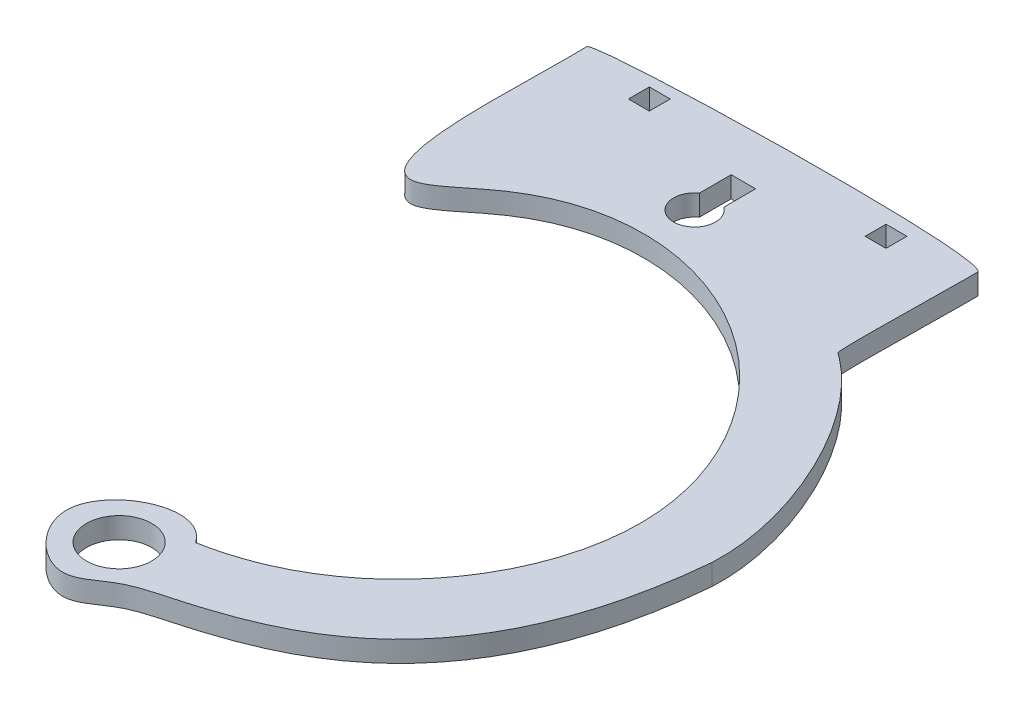
ISO-10303-21;
HEADER;
FILE_DESCRIPTION(('STEP AP214'),'2;1');
FILE_NAME('part.step','',(''),(''),'','','');
FILE_SCHEMA(('AUTOMOTIVE_DESIGN { 1 0 10303 214 1 1 1 1 }'));
ENDSEC;
DATA;
#1=APPLICATION_CONTEXT('core data for automotive mechanical design processes');
#2=APPLICATION_PROTOCOL_DEFINITION('international standard','automotive_design',2000,#1);
#3=PRODUCT_CONTEXT('',#1,'mechanical');
#4=PRODUCT('Part','Part','',(#3));
#5=PRODUCT_RELATED_PRODUCT_CATEGORY('part','',(#4));
#6=PRODUCT_DEFINITION_FORMATION('','',#4);
#7=PRODUCT_DEFINITION_CONTEXT('part definition',#1,'design');
#8=PRODUCT_DEFINITION('design','',#6,#7);
#9=PRODUCT_DEFINITION_SHAPE('','',#8);
#10=(LENGTH_UNIT() NAMED_UNIT(*) SI_UNIT(.MILLI.,.METRE.));
#11=(NAMED_UNIT(*) PLANE_ANGLE_UNIT() SI_UNIT($,.RADIAN.));
#12=(NAMED_UNIT(*) SI_UNIT($,.STERADIAN.) SOLID_ANGLE_UNIT());
#13=UNCERTAINTY_MEASURE_WITH_UNIT(LENGTH_MEASURE(1.E-05),#10,'distance_accuracy_value','');
#14=(GEOMETRIC_REPRESENTATION_CONTEXT(3) GLOBAL_UNCERTAINTY_ASSIGNED_CONTEXT((#13)) GLOBAL_UNIT_ASSIGNED_CONTEXT((#10,
#11,#12)) REPRESENTATION_CONTEXT('',''));
#15=CARTESIAN_POINT('',(0.,0.,0.));
#16=DIRECTION('',(0.,0.,1.));
#17=DIRECTION('',(1.,0.,0.));
#18=AXIS2_PLACEMENT_3D('',#15,#16,#17);
#19=CARTESIAN_POINT('',(5.52155748370861,3.,34.56171875));
#20=CARTESIAN_POINT('',(1.75457626593996,3.,29.0678926339568));
#21=CARTESIAN_POINT('',(-14.2628126377582,3.,37.3251737999894));
#22=CARTESIAN_POINT('',(-0.816124687698605,3.,50.4605636092557));
#23=CARTESIAN_POINT('',(4.47781550421018,3.,44.8708590645014));
#24=CARTESIAN_POINT('',(19.7672053678462,3.,40.7525704051218));
#25=CARTESIAN_POINT('',(41.8350730212651,3.,33.8354091874432));
#26=CARTESIAN_POINT('',(45.,3.,0.));
#27=B_SPLINE_CURVE_WITH_KNOTS('',3,(#19,#20,#21,#22,#23,#24,#25,#26),.UNSPECIFIED.,.F.,.F.,(4,1,
1,1,1,4),(0.,0.248435928445645,0.409115666517532,0.501869332977568,0.560957766325815,1.),.UNSPECIFIED.);
#28=DIRECTION('',(0.,-1.,0.));
#29=VECTOR('',#28,1.);
#30=SURFACE_OF_LINEAR_EXTRUSION('',#27,#29);
#31=CARTESIAN_POINT('',(5.52155748370861,0.,34.56171875));
#32=CARTESIAN_POINT('',(1.75457626593996,0.,29.0678926339568));
#33=CARTESIAN_POINT('',(-14.2628126377582,0.,37.3251737999894));
#34=CARTESIAN_POINT('',(-0.816124687698605,0.,50.4605636092557));
#35=CARTESIAN_POINT('',(4.47781550421018,0.,44.8708590645014));
#36=CARTESIAN_POINT('',(19.7672053678462,0.,40.7525704051218));
#37=CARTESIAN_POINT('',(41.8350730212651,0.,33.8354091874432));
#38=CARTESIAN_POINT('',(45.,0.,0.));
#39=B_SPLINE_CURVE_WITH_KNOTS('',3,(#31,#32,#33,#34,#35,#36,#37,#38),.UNSPECIFIED.,.F.,.F.,(4,1,
1,1,1,4),(0.,0.248435928445645,0.409115666517532,0.501869332977568,0.560957766325815,1.),.UNSPECIFIED.);
#40=CARTESIAN_POINT('',(5.5215574837086,0.,34.56171875));
#41=VERTEX_POINT('',#40);
#42=CARTESIAN_POINT('',(45.,0.,1.28897821374382E-13));
#43=VERTEX_POINT('',#42);
#44=EDGE_CURVE('E227',#41,#43,#39,.T.);
#45=ORIENTED_EDGE('',*,*,#44,.T.);
#46=DIRECTION('',(0.,-1.,0.));
#47=VECTOR('',#46,1.);
#48=CARTESIAN_POINT('',(45.,3.,1.28897821374382E-13));
#49=LINE('',#48,#47);
#50=CARTESIAN_POINT('',(45.,3.,1.28897821374382E-13));
#51=VERTEX_POINT('',#50);
#52=EDGE_CURVE('E320',#51,#43,#49,.T.);
#53=ORIENTED_EDGE('',*,*,#52,.F.);
#54=CARTESIAN_POINT('',(5.5215574837086,3.,34.56171875));
#55=VERTEX_POINT('',#54);
#56=EDGE_CURVE('E230',#55,#51,#27,.T.);
#57=ORIENTED_EDGE('',*,*,#56,.F.);
#58=DIRECTION('',(0.,-1.,0.));
#59=VECTOR('',#58,1.);
#60=CARTESIAN_POINT('',(5.5215574837086,3.,34.56171875));
#61=LINE('',#60,#59);
#62=EDGE_CURVE('E245',#55,#41,#61,.T.);
#63=ORIENTED_EDGE('',*,*,#62,.T.);
#64=EDGE_LOOP('',(#45,#53,#57,#63));
#65=FACE_BOUND('',#64,.T.);
#66=ADVANCED_FACE('F32',(#65),#30,.F.);
#67=CARTESIAN_POINT('',(45.,3.,1.28897821374382E-13));
#68=CARTESIAN_POINT('',(45.5872356507686,3.,-11.4498091188039));
#69=CARTESIAN_POINT('',(37.5515269769713,3.,-28.3604836527118));
#70=CARTESIAN_POINT('',(27.6537379425122,3.,-35.2406958171902));
#71=CARTESIAN_POINT('',(27.9669395349281,3.,-46.9502889949367));
#72=CARTESIAN_POINT('',(28.0110395879902,3.,-57.6879686278624));
#73=CARTESIAN_POINT('',(-28.043237247077,3.,-56.5041897316936));
#74=CARTESIAN_POINT('',(-27.7225426285753,3.,-45.3474768332037));
#75=CARTESIAN_POINT('',(-30.2261834831274,3.,-17.9966032347248));
#76=CARTESIAN_POINT('',(-9.40725411177826,3.,-38.5434879286303));
#77=CARTESIAN_POINT('',(20.3750158900972,3.,-35.3512461572392));
#78=CARTESIAN_POINT('',(44.4623985292645,3.,2.85883580250558));
#79=CARTESIAN_POINT('',(23.4410009987943,3.,31.4117383992043));
#80=CARTESIAN_POINT('',(5.5215574837086,3.,34.56171875));
#81=B_SPLINE_CURVE_WITH_KNOTS('',3,(#67,#68,#69,#70,#71,#72,#73,#74,#75,#76,#77,#78,#79,#80),
.UNSPECIFIED.,.F.,.F.,(4,2,2,2,1,1,1,1,4),(0.,0.689052401124645,0.714031936093828,
0.722373130739638,0.775899340140621,0.791729341638379,0.851260650378715,0.917162435133628,1.),.UNSPECIFIED.);
#82=DIRECTION('',(0.,-1.,0.));
#83=VECTOR('',#82,1.);
#84=SURFACE_OF_LINEAR_EXTRUSION('',#81,#83);
#85=CARTESIAN_POINT('',(45.,0.,1.28897821374382E-13));
#86=CARTESIAN_POINT('',(45.5872356507686,0.,-11.4498091188039));
#87=CARTESIAN_POINT('',(37.5515269769713,0.,-28.3604836527118));
#88=CARTESIAN_POINT('',(27.6537379425122,0.,-35.2406958171902));
#89=CARTESIAN_POINT('',(27.9669395349281,0.,-46.9502889949367));
#90=CARTESIAN_POINT('',(28.0110395879902,0.,-57.6879686278624));
#91=CARTESIAN_POINT('',(-28.043237247077,0.,-56.5041897316936));
#92=CARTESIAN_POINT('',(-27.7225426285753,0.,-45.3474768332037));
#93=CARTESIAN_POINT('',(-30.2261834831274,0.,-17.9966032347248));
#94=CARTESIAN_POINT('',(-9.40725411177826,0.,-38.5434879286303));
#95=CARTESIAN_POINT('',(20.3750158900972,0.,-35.3512461572392));
#96=CARTESIAN_POINT('',(44.4623985292645,0.,2.85883580250558));
#97=CARTESIAN_POINT('',(23.4410009987943,0.,31.4117383992043));
#98=CARTESIAN_POINT('',(5.5215574837086,0.,34.56171875));
#99=B_SPLINE_CURVE_WITH_KNOTS('',3,(#85,#86,#87,#88,#89,#90,#91,#92,#93,#94,#95,#96,#97,#98),
.UNSPECIFIED.,.F.,.F.,(4,2,2,2,1,1,1,1,4),(0.,0.689052401124645,0.714031936093828,
0.722373130739638,0.775899340140621,0.791729341638379,0.851260650378715,0.917162435133628,1.),.UNSPECIFIED.);
#100=EDGE_CURVE('E237',#43,#41,#99,.T.);
#101=ORIENTED_EDGE('',*,*,#100,.T.);
#102=ORIENTED_EDGE('',*,*,#62,.F.);
#103=EDGE_CURVE('E236',#51,#55,#81,.T.);
#104=ORIENTED_EDGE('',*,*,#103,.F.);
#105=ORIENTED_EDGE('',*,*,#52,.T.);
#106=EDGE_LOOP('',(#101,#102,#104,#105));
#107=FACE_BOUND('',#106,.T.);
#108=ADVANCED_FACE('F252',(#107),#84,.F.);
#109=CARTESIAN_POINT('',(5.42939376748954,3.,44.9508710166322));
#110=DIRECTION('',(0.,1.,0.));
#111=DIRECTION('',(0.,0.,1.));
#112=AXIS2_PLACEMENT_3D('',#109,#110,#111);
#113=PLANE('',#112);
#114=DIRECTION('',(-0.00227950526595147,0.,0.999997401924496));
#115=VECTOR('',#114,1.);
#116=CARTESIAN_POINT('',(-18.5103042809626,3.,-54.5046172028867));
#117=LINE('',#116,#115);
#118=CARTESIAN_POINT('',(-18.5103042809626,3.,-54.5046172028867));
#119=VERTEX_POINT('',#118);
#120=CARTESIAN_POINT('',(-18.5171427967605,3.,-51.5046249971132));
#121=VERTEX_POINT('',#120);
#122=EDGE_CURVE('E47',#119,#121,#117,.T.);
#123=ORIENTED_EDGE('',*,*,#122,.F.);
#124=DIRECTION('',(-0.999997401924496,0.,-0.00227950526595263));
#125=VECTOR('',#124,1.);
#126=CARTESIAN_POINT('',(-18.5103042809626,3.,-54.5046172028867));
#127=LINE('',#126,#125);
#128=CARTESIAN_POINT('',(-15.5103120751892,3.,-54.4977786870889));
#129=VERTEX_POINT('',#128);
#130=EDGE_CURVE('E154',#129,#119,#127,.T.);
#131=ORIENTED_EDGE('',*,*,#130,.F.);
#132=DIRECTION('',(0.00227950526595147,0.,-0.999997401924496));
#133=VECTOR('',#132,1.);
#134=CARTESIAN_POINT('',(-15.5103120751892,3.,-54.4977786870889));
#135=LINE('',#134,#133);
#136=CARTESIAN_POINT('',(-15.517150590987,3.,-51.4977864813154));
#137=VERTEX_POINT('',#136);
#138=EDGE_CURVE('E157',#137,#129,#135,.T.);
#139=ORIENTED_EDGE('',*,*,#138,.F.);
#140=DIRECTION('',(0.999997401924496,0.,0.00227950526595263));
#141=VECTOR('',#140,1.);
#142=CARTESIAN_POINT('',(-18.5171427967605,3.,-51.5046249971132));
#143=LINE('',#142,#141);
#144=EDGE_CURVE('E163',#121,#137,#143,.T.);
#145=ORIENTED_EDGE('',*,*,#144,.F.);
#146=EDGE_LOOP('',(#123,#131,#139,#145));
#147=FACE_BOUND('',#146,.T.);
#148=DIRECTION('',(-0.00227950526595262,0.,0.999997401924496));
#149=VECTOR('',#148,1.);
#150=CARTESIAN_POINT('',(15.4827688686724,3.,-51.4271218180709));
#151=LINE('',#150,#149);
#152=CARTESIAN_POINT('',(15.4896073844703,3.,-54.4271140238444));
#153=VERTEX_POINT('',#152);
#154=CARTESIAN_POINT('',(15.4827688686724,3.,-51.4271218180709));
#155=VERTEX_POINT('',#154);
#156=EDGE_CURVE('E55',#153,#155,#151,.T.);
#157=ORIENTED_EDGE('',*,*,#156,.F.);
#158=DIRECTION('',(-0.999997401924496,0.,-0.00227950526595262));
#159=VECTOR('',#158,1.);
#160=CARTESIAN_POINT('',(15.4896073844703,3.,-54.4271140238444));
#161=LINE('',#160,#159);
#162=CARTESIAN_POINT('',(18.4895995902438,3.,-54.4202755080465));
#163=VERTEX_POINT('',#162);
#164=EDGE_CURVE('E178',#163,#153,#161,.T.);
#165=ORIENTED_EDGE('',*,*,#164,.F.);
#166=DIRECTION('',(0.00227950526595263,0.,-0.999997401924496));
#167=VECTOR('',#166,1.);
#168=CARTESIAN_POINT('',(18.4827610744459,3.,-51.420283302273));
#169=LINE('',#168,#167);
#170=CARTESIAN_POINT('',(18.4827610744459,3.,-51.420283302273));
#171=VERTEX_POINT('',#170);
#172=EDGE_CURVE('E192',#171,#163,#169,.T.);
#173=ORIENTED_EDGE('',*,*,#172,.F.);
#174=DIRECTION('',(0.999997401924496,0.,0.00227950526595031));
#175=VECTOR('',#174,1.);
#176=CARTESIAN_POINT('',(15.4827688686724,3.,-51.4271218180709));
#177=LINE('',#176,#175);
#178=EDGE_CURVE('E189',#155,#171,#177,.T.);
#179=ORIENTED_EDGE('',*,*,#178,.F.);
#180=EDGE_LOOP('',(#157,#165,#173,#179));
#181=FACE_BOUND('',#180,.T.);
#182=DIRECTION('',(0.,0.,1.));
#183=VECTOR('',#182,1.);
#184=CARTESIAN_POINT('',(-1.75,3.,-41.4717962113212));
#185=LINE('',#184,#183);
#186=CARTESIAN_POINT('',(-1.75,3.,-49.4717962113212));
#187=VERTEX_POINT('',#186);
#188=CARTESIAN_POINT('',(-1.75,3.,-44.9084947975235));
#189=VERTEX_POINT('',#188);
#190=EDGE_CURVE('E170',#187,#189,#185,.T.);
#191=ORIENTED_EDGE('',*,*,#190,.F.);
#192=DIRECTION('',(-1.,0.,0.));
#193=VECTOR('',#192,1.);
#194=CARTESIAN_POINT('',(1.75,3.,-49.4717962113212));
#195=LINE('',#194,#193);
#196=CARTESIAN_POINT('',(1.75,3.,-49.4717962113212));
#197=VERTEX_POINT('',#196);
#198=EDGE_CURVE('E207',#197,#187,#195,.T.);
#199=ORIENTED_EDGE('',*,*,#198,.F.);
#200=DIRECTION('',(0.,0.,-1.));
#201=VECTOR('',#200,1.);
#202=CARTESIAN_POINT('',(1.75,3.,-41.4717962113212));
#203=LINE('',#202,#201);
#204=CARTESIAN_POINT('',(1.75,3.,-44.9084947975235));
#205=VERTEX_POINT('',#204);
#206=EDGE_CURVE('E204',#205,#197,#203,.T.);
#207=ORIENTED_EDGE('',*,*,#206,.F.);
#208=CARTESIAN_POINT('',(0.,3.,-42.4717962113212));
#209=DIRECTION('',(0.,1.,0.));
#210=DIRECTION('',(0.,0.,1.));
#211=AXIS2_PLACEMENT_3D('',#208,#209,#210);
#212=CIRCLE('',#211,3.);
#213=EDGE_CURVE('E220',#189,#205,#212,.T.);
#214=ORIENTED_EDGE('',*,*,#213,.F.);
#215=EDGE_LOOP('',(#191,#199,#207,#214));
#216=FACE_BOUND('',#215,.T.);
#217=CARTESIAN_POINT('',(0.,3.,40.));
#218=DIRECTION('',(0.,1.,0.));
#219=DIRECTION('',(0.,0.,1.));
#220=AXIS2_PLACEMENT_3D('',#217,#218,#219);
#221=CIRCLE('',#220,4.675);
#222=CARTESIAN_POINT('',(0.,3.,44.675));
#223=VERTEX_POINT('',#222);
#224=EDGE_CURVE('E228',#223,#223,#221,.T.);
#225=ORIENTED_EDGE('',*,*,#224,.F.);
#226=EDGE_LOOP('',(#225));
#227=FACE_BOUND('',#226,.T.);
#228=ORIENTED_EDGE('',*,*,#56,.T.);
#229=ORIENTED_EDGE('',*,*,#103,.T.);
#230=EDGE_LOOP('',(#228,#229));
#231=FACE_BOUND('',#230,.T.);
#232=ADVANCED_FACE('F255',(#147,#181,#216,#227,#231),#113,.T.);
#233=CARTESIAN_POINT('',(5.42939376748954,0.,44.9508710166322));
#234=DIRECTION('',(0.,1.,0.));
#235=DIRECTION('',(0.,0.,1.));
#236=AXIS2_PLACEMENT_3D('',#233,#234,#235);
#237=PLANE('',#236);
#238=DIRECTION('',(-0.999997401924496,0.,-0.00227950526595263));
#239=VECTOR('',#238,1.);
#240=CARTESIAN_POINT('',(-18.5103042809626,0.,-54.5046172028867));
#241=LINE('',#240,#239);
#242=CARTESIAN_POINT('',(-15.5103120751892,0.,-54.4977786870889));
#243=VERTEX_POINT('',#242);
#244=CARTESIAN_POINT('',(-18.5103042809626,0.,-54.5046172028867));
#245=VERTEX_POINT('',#244);
#246=EDGE_CURVE('E141',#243,#245,#241,.T.);
#247=ORIENTED_EDGE('',*,*,#246,.T.);
#248=DIRECTION('',(-0.00227950526595147,0.,0.999997401924496));
#249=VECTOR('',#248,1.);
#250=CARTESIAN_POINT('',(-18.5103042809626,0.,-54.5046172028867));
#251=LINE('',#250,#249);
#252=CARTESIAN_POINT('',(-18.5171427967605,0.,-51.5046249971132));
#253=VERTEX_POINT('',#252);
#254=EDGE_CURVE('E135',#245,#253,#251,.T.);
#255=ORIENTED_EDGE('',*,*,#254,.T.);
#256=DIRECTION('',(0.999997401924496,0.,0.00227950526595263));
#257=VECTOR('',#256,1.);
#258=CARTESIAN_POINT('',(-18.5171427967605,0.,-51.5046249971132));
#259=LINE('',#258,#257);
#260=CARTESIAN_POINT('',(-15.517150590987,0.,-51.4977864813154));
#261=VERTEX_POINT('',#260);
#262=EDGE_CURVE('E145',#253,#261,#259,.T.);
#263=ORIENTED_EDGE('',*,*,#262,.T.);
#264=DIRECTION('',(0.00227950526595147,0.,-0.999997401924496));
#265=VECTOR('',#264,1.);
#266=CARTESIAN_POINT('',(-15.5103120751892,0.,-54.4977786870889));
#267=LINE('',#266,#265);
#268=EDGE_CURVE('E149',#261,#243,#267,.T.);
#269=ORIENTED_EDGE('',*,*,#268,.T.);
#270=EDGE_LOOP('',(#247,#255,#263,#269));
#271=FACE_BOUND('',#270,.T.);
#272=DIRECTION('',(-0.999997401924496,0.,-0.00227950526595262));
#273=VECTOR('',#272,1.);
#274=CARTESIAN_POINT('',(15.4896073844703,0.,-54.4271140238444));
#275=LINE('',#274,#273);
#276=CARTESIAN_POINT('',(18.4895995902438,0.,-54.4202755080465));
#277=VERTEX_POINT('',#276);
#278=CARTESIAN_POINT('',(15.4896073844703,0.,-54.4271140238444));
#279=VERTEX_POINT('',#278);
#280=EDGE_CURVE('E184',#277,#279,#275,.T.);
#281=ORIENTED_EDGE('',*,*,#280,.T.);
#282=DIRECTION('',(-0.00227950526595262,0.,0.999997401924496));
#283=VECTOR('',#282,1.);
#284=CARTESIAN_POINT('',(15.4827688686724,0.,-51.4271218180709));
#285=LINE('',#284,#283);
#286=CARTESIAN_POINT('',(15.4827688686724,0.,-51.4271218180709));
#287=VERTEX_POINT('',#286);
#288=EDGE_CURVE('E174',#279,#287,#285,.T.);
#289=ORIENTED_EDGE('',*,*,#288,.T.);
#290=DIRECTION('',(0.999997401924496,0.,0.00227950526595031));
#291=VECTOR('',#290,1.);
#292=CARTESIAN_POINT('',(15.4827688686724,0.,-51.4271218180709));
#293=LINE('',#292,#291);
#294=CARTESIAN_POINT('',(18.4827610744459,0.,-51.420283302273));
#295=VERTEX_POINT('',#294);
#296=EDGE_CURVE('E177',#287,#295,#293,.T.);
#297=ORIENTED_EDGE('',*,*,#296,.T.);
#298=DIRECTION('',(0.00227950526595263,0.,-0.999997401924496));
#299=VECTOR('',#298,1.);
#300=CARTESIAN_POINT('',(18.4827610744459,0.,-51.420283302273));
#301=LINE('',#300,#299);
#302=EDGE_CURVE('E181',#295,#277,#301,.T.);
#303=ORIENTED_EDGE('',*,*,#302,.T.);
#304=EDGE_LOOP('',(#281,#289,#297,#303));
#305=FACE_BOUND('',#304,.T.);
#306=DIRECTION('',(-1.,0.,0.));
#307=VECTOR('',#306,1.);
#308=CARTESIAN_POINT('',(5.42939376748954,0.,-49.4717962113212));
#309=LINE('',#308,#307);
#310=CARTESIAN_POINT('',(1.75,0.,-49.4717962113212));
#311=VERTEX_POINT('',#310);
#312=CARTESIAN_POINT('',(-1.75,0.,-49.4717962113212));
#313=VERTEX_POINT('',#312);
#314=EDGE_CURVE('E11',#311,#313,#309,.T.);
#315=ORIENTED_EDGE('',*,*,#314,.T.);
#316=DIRECTION('',(0.,0.,1.));
#317=VECTOR('',#316,1.);
#318=CARTESIAN_POINT('',(-1.75,0.,44.9508710166322));
#319=LINE('',#318,#317);
#320=CARTESIAN_POINT('',(-1.75,0.,-44.9084947975235));
#321=VERTEX_POINT('',#320);
#322=EDGE_CURVE('E217',#313,#321,#319,.T.);
#323=ORIENTED_EDGE('',*,*,#322,.T.);
#324=CARTESIAN_POINT('',(0.,0.,-42.4717962113212));
#325=DIRECTION('',(0.,1.,0.));
#326=DIRECTION('',(0.,0.,1.));
#327=AXIS2_PLACEMENT_3D('',#324,#325,#326);
#328=CIRCLE('',#327,3.);
#329=CARTESIAN_POINT('',(1.75,0.,-44.9084947975235));
#330=VERTEX_POINT('',#329);
#331=EDGE_CURVE('E223',#321,#330,#328,.T.);
#332=ORIENTED_EDGE('',*,*,#331,.T.);
#333=DIRECTION('',(0.,0.,-1.));
#334=VECTOR('',#333,1.);
#335=CARTESIAN_POINT('',(1.75,0.,44.9508710166322));
#336=LINE('',#335,#334);
#337=EDGE_CURVE('E213',#330,#311,#336,.T.);
#338=ORIENTED_EDGE('',*,*,#337,.T.);
#339=EDGE_LOOP('',(#315,#323,#332,#338));
#340=FACE_BOUND('',#339,.T.);
#341=CARTESIAN_POINT('',(0.,0.,40.));
#342=DIRECTION('',(0.,1.,0.));
#343=DIRECTION('',(0.,0.,1.));
#344=AXIS2_PLACEMENT_3D('',#341,#342,#343);
#345=CIRCLE('',#344,4.675);
#346=CARTESIAN_POINT('',(0.,0.,44.675));
#347=VERTEX_POINT('',#346);
#348=EDGE_CURVE('E224',#347,#347,#345,.T.);
#349=ORIENTED_EDGE('',*,*,#348,.T.);
#350=EDGE_LOOP('',(#349));
#351=FACE_BOUND('',#350,.T.);
#352=ORIENTED_EDGE('',*,*,#44,.F.);
#353=ORIENTED_EDGE('',*,*,#100,.F.);
#354=EDGE_LOOP('',(#352,#353));
#355=FACE_BOUND('',#354,.T.);
#356=ADVANCED_FACE('F151',(#271,#305,#340,#351,#355),#237,.F.);
#357=CARTESIAN_POINT('',(0.,0.,40.));
#358=DIRECTION('',(0.,1.,0.));
#359=DIRECTION('',(0.,0.,1.));
#360=AXIS2_PLACEMENT_3D('',#357,#358,#359);
#361=CYLINDRICAL_SURFACE('',#360,4.675);
#362=ORIENTED_EDGE('',*,*,#348,.F.);
#363=EDGE_LOOP('',(#362));
#364=FACE_BOUND('',#363,.T.);
#365=ORIENTED_EDGE('',*,*,#224,.T.);
#366=EDGE_LOOP('',(#365));
#367=FACE_BOUND('',#366,.T.);
#368=ADVANCED_FACE('F259',(#364,#367),#361,.F.);
#369=CARTESIAN_POINT('',(0.,-3.,-42.4717962113212));
#370=DIRECTION('',(0.,1.,0.));
#371=DIRECTION('',(0.,0.,1.));
#372=AXIS2_PLACEMENT_3D('',#369,#370,#371);
#373=CYLINDRICAL_SURFACE('',#372,3.);
#374=ORIENTED_EDGE('',*,*,#331,.F.);
#375=DIRECTION('',(0.,1.,0.));
#376=VECTOR('',#375,1.);
#377=CARTESIAN_POINT('',(-1.75,-3.,-44.9084947975235));
#378=LINE('',#377,#376);
#379=EDGE_CURVE('E40',#321,#189,#378,.T.);
#380=ORIENTED_EDGE('',*,*,#379,.T.);
#381=ORIENTED_EDGE('',*,*,#213,.T.);
#382=DIRECTION('',(0.,1.,0.));
#383=VECTOR('',#382,1.);
#384=CARTESIAN_POINT('',(1.75,-3.,-44.9084947975235));
#385=LINE('',#384,#383);
#386=EDGE_CURVE('E331',#205,#330,#385,.F.);
#387=ORIENTED_EDGE('',*,*,#386,.T.);
#388=EDGE_LOOP('',(#374,#380,#381,#387));
#389=FACE_BOUND('',#388,.T.);
#390=ADVANCED_FACE('F265',(#389),#373,.F.);
#391=CARTESIAN_POINT('',(1.75,-3.,-49.4717962113212));
#392=DIRECTION('',(0.,0.,-1.));
#393=DIRECTION('',(-1.,0.,0.));
#394=AXIS2_PLACEMENT_3D('',#391,#392,#393);
#395=PLANE('',#394);
#396=DIRECTION('',(0.,1.,0.));
#397=VECTOR('',#396,1.);
#398=CARTESIAN_POINT('',(1.75,-3.,-49.4717962113212));
#399=LINE('',#398,#397);
#400=EDGE_CURVE('E210',#311,#197,#399,.T.);
#401=ORIENTED_EDGE('',*,*,#400,.T.);
#402=ORIENTED_EDGE('',*,*,#198,.T.);
#403=DIRECTION('',(0.,1.,0.));
#404=VECTOR('',#403,1.);
#405=CARTESIAN_POINT('',(-1.75,-3.,-49.4717962113212));
#406=LINE('',#405,#404);
#407=EDGE_CURVE('E211',#313,#187,#406,.T.);
#408=ORIENTED_EDGE('',*,*,#407,.F.);
#409=ORIENTED_EDGE('',*,*,#314,.F.);
#410=EDGE_LOOP('',(#401,#402,#408,#409));
#411=FACE_BOUND('',#410,.T.);
#412=ADVANCED_FACE('F269',(#411),#395,.F.);
#413=CARTESIAN_POINT('',(-1.75,-3.,-41.4717962113212));
#414=DIRECTION('',(-1.,0.,0.));
#415=DIRECTION('',(0.,0.,1.));
#416=AXIS2_PLACEMENT_3D('',#413,#414,#415);
#417=PLANE('',#416);
#418=ORIENTED_EDGE('',*,*,#407,.T.);
#419=ORIENTED_EDGE('',*,*,#190,.T.);
#420=ORIENTED_EDGE('',*,*,#379,.F.);
#421=ORIENTED_EDGE('',*,*,#322,.F.);
#422=EDGE_LOOP('',(#418,#419,#420,#421));
#423=FACE_BOUND('',#422,.T.);
#424=ADVANCED_FACE('F271',(#423),#417,.F.);
#425=CARTESIAN_POINT('',(1.75,-3.,-41.4717962113212));
#426=DIRECTION('',(1.,0.,0.));
#427=DIRECTION('',(0.,0.,-1.));
#428=AXIS2_PLACEMENT_3D('',#425,#426,#427);
#429=PLANE('',#428);
#430=ORIENTED_EDGE('',*,*,#386,.F.);
#431=ORIENTED_EDGE('',*,*,#206,.T.);
#432=ORIENTED_EDGE('',*,*,#400,.F.);
#433=ORIENTED_EDGE('',*,*,#337,.F.);
#434=EDGE_LOOP('',(#430,#431,#432,#433));
#435=FACE_BOUND('',#434,.T.);
#436=ADVANCED_FACE('F274',(#435),#429,.F.);
#437=CARTESIAN_POINT('',(15.4827688686724,0.,-51.4271218180709));
#438=DIRECTION('',(-0.999997401924496,0.,-0.00227950526595262));
#439=DIRECTION('',(-0.00227950526595262,0.,0.999997401924496));
#440=AXIS2_PLACEMENT_3D('',#437,#438,#439);
#441=PLANE('',#440);
#442=ORIENTED_EDGE('',*,*,#156,.T.);
#443=DIRECTION('',(0.,1.,0.));
#444=VECTOR('',#443,1.);
#445=CARTESIAN_POINT('',(15.4827688686724,0.,-51.4271218180709));
#446=LINE('',#445,#444);
#447=EDGE_CURVE('E187',#287,#155,#446,.T.);
#448=ORIENTED_EDGE('',*,*,#447,.F.);
#449=ORIENTED_EDGE('',*,*,#288,.F.);
#450=DIRECTION('',(0.,1.,0.));
#451=VECTOR('',#450,1.);
#452=CARTESIAN_POINT('',(15.4896073844703,0.,-54.4271140238444));
#453=LINE('',#452,#451);
#454=EDGE_CURVE('E164',#279,#153,#453,.T.);
#455=ORIENTED_EDGE('',*,*,#454,.T.);
#456=EDGE_LOOP('',(#442,#448,#449,#455));
#457=FACE_BOUND('',#456,.T.);
#458=ADVANCED_FACE('F278',(#457),#441,.F.);
#459=CARTESIAN_POINT('',(15.4896073844703,0.,-54.4271140238444));
#460=DIRECTION('',(0.00227950526595262,0.,-0.999997401924496));
#461=DIRECTION('',(-0.999997401924496,0.,-0.00227950526595262));
#462=AXIS2_PLACEMENT_3D('',#459,#460,#461);
#463=PLANE('',#462);
#464=ORIENTED_EDGE('',*,*,#164,.T.);
#465=ORIENTED_EDGE('',*,*,#454,.F.);
#466=ORIENTED_EDGE('',*,*,#280,.F.);
#467=DIRECTION('',(0.,1.,0.));
#468=VECTOR('',#467,1.);
#469=CARTESIAN_POINT('',(18.4895995902438,0.,-54.4202755080465));
#470=LINE('',#469,#468);
#471=EDGE_CURVE('E198',#277,#163,#470,.T.);
#472=ORIENTED_EDGE('',*,*,#471,.T.);
#473=EDGE_LOOP('',(#464,#465,#466,#472));
#474=FACE_BOUND('',#473,.T.);
#475=ADVANCED_FACE('F285',(#474),#463,.F.);
#476=CARTESIAN_POINT('',(18.4827610744459,0.,-51.420283302273));
#477=DIRECTION('',(0.999997401924496,0.,0.00227950526595263));
#478=DIRECTION('',(0.00227950526595263,0.,-0.999997401924496));
#479=AXIS2_PLACEMENT_3D('',#476,#477,#478);
#480=PLANE('',#479);
#481=ORIENTED_EDGE('',*,*,#172,.T.);
#482=ORIENTED_EDGE('',*,*,#471,.F.);
#483=ORIENTED_EDGE('',*,*,#302,.F.);
#484=DIRECTION('',(0.,1.,0.));
#485=VECTOR('',#484,1.);
#486=CARTESIAN_POINT('',(18.4827610744459,0.,-51.420283302273));
#487=LINE('',#486,#485);
#488=EDGE_CURVE('E200',#295,#171,#487,.T.);
#489=ORIENTED_EDGE('',*,*,#488,.T.);
#490=EDGE_LOOP('',(#481,#482,#483,#489));
#491=FACE_BOUND('',#490,.T.);
#492=ADVANCED_FACE('F289',(#491),#480,.F.);
#493=CARTESIAN_POINT('',(15.4827688686724,0.,-51.4271218180709));
#494=DIRECTION('',(-0.00227950526595031,0.,0.999997401924496));
#495=DIRECTION('',(0.999997401924496,0.,0.00227950526595031));
#496=AXIS2_PLACEMENT_3D('',#493,#494,#495);
#497=PLANE('',#496);
#498=ORIENTED_EDGE('',*,*,#178,.T.);
#499=ORIENTED_EDGE('',*,*,#488,.F.);
#500=ORIENTED_EDGE('',*,*,#296,.F.);
#501=ORIENTED_EDGE('',*,*,#447,.T.);
#502=EDGE_LOOP('',(#498,#499,#500,#501));
#503=FACE_BOUND('',#502,.T.);
#504=ADVANCED_FACE('F286',(#503),#497,.F.);
#505=CARTESIAN_POINT('',(-18.5103042809626,0.,-54.5046172028867));
#506=DIRECTION('',(-0.999997401924496,0.,-0.00227950526595147));
#507=DIRECTION('',(-0.00227950526595147,0.,0.999997401924496));
#508=AXIS2_PLACEMENT_3D('',#505,#506,#507);
#509=PLANE('',#508);
#510=ORIENTED_EDGE('',*,*,#122,.T.);
#511=DIRECTION('',(0.,1.,0.));
#512=VECTOR('',#511,1.);
#513=CARTESIAN_POINT('',(-18.5171427967605,0.,-51.5046249971132));
#514=LINE('',#513,#512);
#515=EDGE_CURVE('E131',#253,#121,#514,.T.);
#516=ORIENTED_EDGE('',*,*,#515,.F.);
#517=ORIENTED_EDGE('',*,*,#254,.F.);
#518=DIRECTION('',(0.,1.,0.));
#519=VECTOR('',#518,1.);
#520=CARTESIAN_POINT('',(-18.5103042809626,0.,-54.5046172028867));
#521=LINE('',#520,#519);
#522=EDGE_CURVE('E168',#245,#119,#521,.T.);
#523=ORIENTED_EDGE('',*,*,#522,.T.);
#524=EDGE_LOOP('',(#510,#516,#517,#523));
#525=FACE_BOUND('',#524,.T.);
#526=ADVANCED_FACE('F133',(#525),#509,.F.);
#527=CARTESIAN_POINT('',(-18.5103042809626,0.,-54.5046172028867));
#528=DIRECTION('',(0.00227950526595263,0.,-0.999997401924496));
#529=DIRECTION('',(-0.999997401924496,0.,-0.00227950526595263));
#530=AXIS2_PLACEMENT_3D('',#527,#528,#529);
#531=PLANE('',#530);
#532=ORIENTED_EDGE('',*,*,#130,.T.);
#533=ORIENTED_EDGE('',*,*,#522,.F.);
#534=ORIENTED_EDGE('',*,*,#246,.F.);
#535=DIRECTION('',(0.,1.,0.));
#536=VECTOR('',#535,1.);
#537=CARTESIAN_POINT('',(-15.5103120751892,0.,-54.4977786870889));
#538=LINE('',#537,#536);
#539=EDGE_CURVE('E171',#243,#129,#538,.T.);
#540=ORIENTED_EDGE('',*,*,#539,.T.);
#541=EDGE_LOOP('',(#532,#533,#534,#540));
#542=FACE_BOUND('',#541,.T.);
#543=ADVANCED_FACE('F299',(#542),#531,.F.);
#544=CARTESIAN_POINT('',(-15.5103120751892,0.,-54.4977786870889));
#545=DIRECTION('',(0.999997401924496,0.,0.00227950526595147));
#546=DIRECTION('',(0.00227950526595147,0.,-0.999997401924496));
#547=AXIS2_PLACEMENT_3D('',#544,#545,#546);
#548=PLANE('',#547);
#549=ORIENTED_EDGE('',*,*,#138,.T.);
#550=ORIENTED_EDGE('',*,*,#539,.F.);
#551=ORIENTED_EDGE('',*,*,#268,.F.);
#552=DIRECTION('',(0.,1.,0.));
#553=VECTOR('',#552,1.);
#554=CARTESIAN_POINT('',(-15.517150590987,0.,-51.4977864813154));
#555=LINE('',#554,#553);
#556=EDGE_CURVE('E140',#261,#137,#555,.T.);
#557=ORIENTED_EDGE('',*,*,#556,.T.);
#558=EDGE_LOOP('',(#549,#550,#551,#557));
#559=FACE_BOUND('',#558,.T.);
#560=ADVANCED_FACE('F302',(#559),#548,.F.);
#561=CARTESIAN_POINT('',(-18.5171427967605,0.,-51.5046249971132));
#562=DIRECTION('',(-0.00227950526595263,0.,0.999997401924496));
#563=DIRECTION('',(0.999997401924496,0.,0.00227950526595263));
#564=AXIS2_PLACEMENT_3D('',#561,#562,#563);
#565=PLANE('',#564);
#566=ORIENTED_EDGE('',*,*,#144,.T.);
#567=ORIENTED_EDGE('',*,*,#556,.F.);
#568=ORIENTED_EDGE('',*,*,#262,.F.);
#569=ORIENTED_EDGE('',*,*,#515,.T.);
#570=EDGE_LOOP('',(#566,#567,#568,#569));
#571=FACE_BOUND('',#570,.T.);
#572=ADVANCED_FACE('F146',(#571),#565,.F.);
#573=CLOSED_SHELL('',(#66,#108,#232,#356,#368,#390,#412,#424,#436,#458,#475,#492,#504,#526,#543,
#560,#572));
#574=MANIFOLD_SOLID_BREP('B2',#573);
#575=ADVANCED_BREP_SHAPE_REPRESENTATION('',(#18,#574),#14);
#576=SHAPE_DEFINITION_REPRESENTATION(#9,#575);
ENDSEC;
END-ISO-10303-21;
